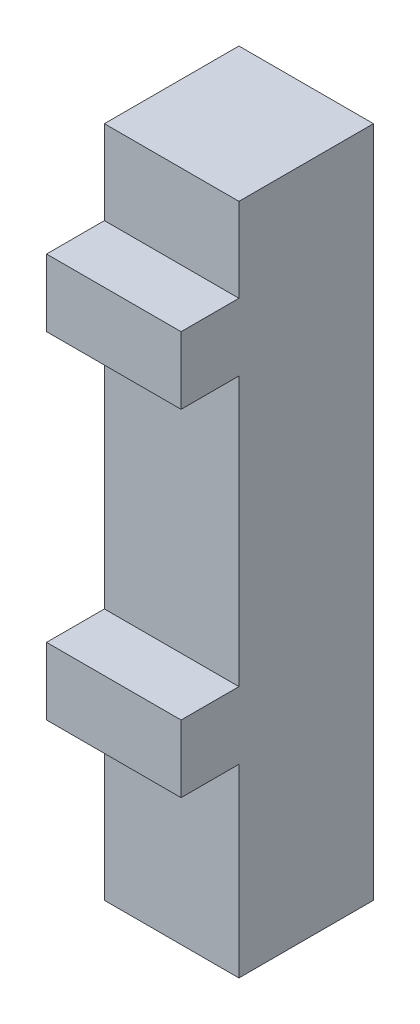
ISO-10303-21;
HEADER;
FILE_DESCRIPTION(('STEP AP214'),'2;1');
FILE_NAME('part.step','',(''),(''),'','','');
FILE_SCHEMA(('AUTOMOTIVE_DESIGN { 1 0 10303 214 1 1 1 1 }'));
ENDSEC;
DATA;
#1=APPLICATION_CONTEXT('core data for automotive mechanical design processes');
#2=APPLICATION_PROTOCOL_DEFINITION('international standard','automotive_design',2000,#1);
#3=PRODUCT_CONTEXT('',#1,'mechanical');
#4=PRODUCT('Part','Part','',(#3));
#5=PRODUCT_RELATED_PRODUCT_CATEGORY('part','',(#4));
#6=PRODUCT_DEFINITION_FORMATION('','',#4);
#7=PRODUCT_DEFINITION_CONTEXT('part definition',#1,'design');
#8=PRODUCT_DEFINITION('design','',#6,#7);
#9=PRODUCT_DEFINITION_SHAPE('','',#8);
#10=(LENGTH_UNIT() NAMED_UNIT(*) SI_UNIT(.MILLI.,.METRE.));
#11=(NAMED_UNIT(*) PLANE_ANGLE_UNIT() SI_UNIT($,.RADIAN.));
#12=(NAMED_UNIT(*) SI_UNIT($,.STERADIAN.) SOLID_ANGLE_UNIT());
#13=UNCERTAINTY_MEASURE_WITH_UNIT(LENGTH_MEASURE(1.E-05),#10,'distance_accuracy_value','');
#14=(GEOMETRIC_REPRESENTATION_CONTEXT(3) GLOBAL_UNCERTAINTY_ASSIGNED_CONTEXT((#13)) GLOBAL_UNIT_ASSIGNED_CONTEXT((#10,
#11,#12)) REPRESENTATION_CONTEXT('',''));
#15=CARTESIAN_POINT('',(0.,0.,0.));
#16=DIRECTION('',(0.,0.,1.));
#17=DIRECTION('',(1.,0.,0.));
#18=AXIS2_PLACEMENT_3D('',#15,#16,#17);
#19=CARTESIAN_POINT('',(-30.6224066390041,500.,79.7095435684647));
#20=DIRECTION('',(0.,0.,-1.));
#21=DIRECTION('',(-1.,0.,0.));
#22=AXIS2_PLACEMENT_3D('',#19,#20,#21);
#23=PLANE('',#22);
#24=DIRECTION('',(1.,0.,0.));
#25=VECTOR('',#24,1.);
#26=CARTESIAN_POINT('',(-30.6224066390041,137.588238815811,79.7095435684647));
#27=LINE('',#26,#25);
#28=CARTESIAN_POINT('',(-30.6224066390041,137.588238815811,79.7095435684647));
#29=VERTEX_POINT('',#28);
#30=CARTESIAN_POINT('',(69.3775933609959,137.588238815811,79.7095435684647));
#31=VERTEX_POINT('',#30);
#32=EDGE_CURVE('E144',#29,#31,#27,.T.);
#33=ORIENTED_EDGE('',*,*,#32,.F.);
#34=DIRECTION('',(0.,-1.,0.));
#35=VECTOR('',#34,1.);
#36=CARTESIAN_POINT('',(-30.6224066390041,500.,79.7095435684647));
#37=LINE('',#36,#35);
#38=CARTESIAN_POINT('',(-30.6224066390041,0.,79.7095435684647));
#39=VERTEX_POINT('',#38);
#40=EDGE_CURVE('E48',#29,#39,#37,.T.);
#41=ORIENTED_EDGE('',*,*,#40,.T.);
#42=DIRECTION('',(1.,0.,0.));
#43=VECTOR('',#42,1.);
#44=CARTESIAN_POINT('',(-30.6224066390041,0.,79.7095435684647));
#45=LINE('',#44,#43);
#46=CARTESIAN_POINT('',(69.3775933609959,0.,79.7095435684647));
#47=VERTEX_POINT('',#46);
#48=EDGE_CURVE('E186',#39,#47,#45,.T.);
#49=ORIENTED_EDGE('',*,*,#48,.T.);
#50=DIRECTION('',(0.,-1.,0.));
#51=VECTOR('',#50,1.);
#52=CARTESIAN_POINT('',(69.3775933609959,500.,79.7095435684647));
#53=LINE('',#52,#51);
#54=EDGE_CURVE('E164',#31,#47,#53,.T.);
#55=ORIENTED_EDGE('',*,*,#54,.F.);
#56=EDGE_LOOP('',(#33,#41,#49,#55));
#57=FACE_BOUND('',#56,.T.);
#58=ADVANCED_FACE('F39',(#57),#23,.F.);
#59=DIRECTION('',(-1.,0.,0.));
#60=VECTOR('',#59,1.);
#61=CARTESIAN_POINT('',(69.3775933609959,187.588238815811,79.7095435684647));
#62=LINE('',#61,#60);
#63=CARTESIAN_POINT('',(69.3775933609959,187.588238815811,79.7095435684647));
#64=VERTEX_POINT('',#63);
#65=CARTESIAN_POINT('',(-30.6224066390041,187.588238815811,79.7095435684647));
#66=VERTEX_POINT('',#65);
#67=EDGE_CURVE('E132',#64,#66,#62,.T.);
#68=ORIENTED_EDGE('',*,*,#67,.F.);
#69=CARTESIAN_POINT('',(69.3775933609959,387.588238815811,79.7095435684647));
#70=VERTEX_POINT('',#69);
#71=EDGE_CURVE('E163',#70,#64,#53,.T.);
#72=ORIENTED_EDGE('',*,*,#71,.F.);
#73=DIRECTION('',(-1.,0.,0.));
#74=VECTOR('',#73,1.);
#75=CARTESIAN_POINT('',(0.,387.588238815811,79.7095435684647));
#76=LINE('',#75,#74);
#77=CARTESIAN_POINT('',(-30.6224066390041,387.588238815811,79.7095435684647));
#78=VERTEX_POINT('',#77);
#79=EDGE_CURVE('E155',#70,#78,#76,.T.);
#80=ORIENTED_EDGE('',*,*,#79,.T.);
#81=EDGE_CURVE('E47',#78,#66,#37,.T.);
#82=ORIENTED_EDGE('',*,*,#81,.T.);
#83=EDGE_LOOP('',(#68,#72,#80,#82));
#84=FACE_BOUND('',#83,.T.);
#85=ADVANCED_FACE('F154',(#84),#23,.F.);
#86=CARTESIAN_POINT('',(-30.6224066390041,500.,79.7095435684647));
#87=VERTEX_POINT('',#86);
#88=CARTESIAN_POINT('',(-30.6224066390041,437.588238815811,79.7095435684647));
#89=VERTEX_POINT('',#88);
#90=EDGE_CURVE('E11',#87,#89,#37,.T.);
#91=ORIENTED_EDGE('',*,*,#90,.T.);
#92=DIRECTION('',(1.,0.,0.));
#93=VECTOR('',#92,1.);
#94=CARTESIAN_POINT('',(0.,437.588238815811,79.7095435684647));
#95=LINE('',#94,#93);
#96=CARTESIAN_POINT('',(69.3775933609959,437.588238815811,79.7095435684647));
#97=VERTEX_POINT('',#96);
#98=EDGE_CURVE('E207',#89,#97,#95,.T.);
#99=ORIENTED_EDGE('',*,*,#98,.T.);
#100=CARTESIAN_POINT('',(69.3775933609959,500.,79.7095435684647));
#101=VERTEX_POINT('',#100);
#102=EDGE_CURVE('E156',#101,#97,#53,.T.);
#103=ORIENTED_EDGE('',*,*,#102,.F.);
#104=DIRECTION('',(1.,0.,0.));
#105=VECTOR('',#104,1.);
#106=CARTESIAN_POINT('',(-30.6224066390041,500.,79.7095435684647));
#107=LINE('',#106,#105);
#108=EDGE_CURVE('E194',#87,#101,#107,.T.);
#109=ORIENTED_EDGE('',*,*,#108,.F.);
#110=EDGE_LOOP('',(#91,#99,#103,#109));
#111=FACE_BOUND('',#110,.T.);
#112=ADVANCED_FACE('F241',(#111),#23,.F.);
#113=CARTESIAN_POINT('',(-30.6224066390042,500.,-20.2904564315353));
#114=DIRECTION('',(1.,0.,0.));
#115=DIRECTION('',(0.,0.,-1.));
#116=AXIS2_PLACEMENT_3D('',#113,#114,#115);
#117=PLANE('',#116);
#118=DIRECTION('',(0.,0.,1.));
#119=VECTOR('',#118,1.);
#120=CARTESIAN_POINT('',(-30.6224066390042,0.,-20.2904564315353));
#121=LINE('',#120,#119);
#122=CARTESIAN_POINT('',(-30.6224066390042,0.,-20.2904564315353));
#123=VERTEX_POINT('',#122);
#124=EDGE_CURVE('E188',#123,#39,#121,.T.);
#125=ORIENTED_EDGE('',*,*,#124,.T.);
#126=ORIENTED_EDGE('',*,*,#40,.F.);
#127=DIRECTION('',(0.,0.,-1.));
#128=VECTOR('',#127,1.);
#129=CARTESIAN_POINT('',(-30.6224066390041,137.588238815811,122.709543568465));
#130=LINE('',#129,#128);
#131=CARTESIAN_POINT('',(-30.6224066390041,137.588238815811,122.709543568465));
#132=VERTEX_POINT('',#131);
#133=EDGE_CURVE('E226',#132,#29,#130,.T.);
#134=ORIENTED_EDGE('',*,*,#133,.F.);
#135=DIRECTION('',(0.,-1.,0.));
#136=VECTOR('',#135,1.);
#137=CARTESIAN_POINT('',(-30.6224066390041,187.588238815811,122.709543568465));
#138=LINE('',#137,#136);
#139=CARTESIAN_POINT('',(-30.6224066390041,187.588238815811,122.709543568465));
#140=VERTEX_POINT('',#139);
#141=EDGE_CURVE('E145',#140,#132,#138,.T.);
#142=ORIENTED_EDGE('',*,*,#141,.F.);
#143=DIRECTION('',(0.,0.,-1.));
#144=VECTOR('',#143,1.);
#145=CARTESIAN_POINT('',(-30.6224066390041,187.588238815811,122.709543568465));
#146=LINE('',#145,#144);
#147=EDGE_CURVE('E136',#140,#66,#146,.T.);
#148=ORIENTED_EDGE('',*,*,#147,.T.);
#149=ORIENTED_EDGE('',*,*,#81,.F.);
#150=DIRECTION('',(0.,0.,-1.));
#151=VECTOR('',#150,1.);
#152=CARTESIAN_POINT('',(-30.6224066390041,387.588238815811,122.709543568465));
#153=LINE('',#152,#151);
#154=CARTESIAN_POINT('',(-30.6224066390041,387.588238815811,122.709543568465));
#155=VERTEX_POINT('',#154);
#156=EDGE_CURVE('E63',#155,#78,#153,.T.);
#157=ORIENTED_EDGE('',*,*,#156,.F.);
#158=DIRECTION('',(0.,-1.,0.));
#159=VECTOR('',#158,1.);
#160=CARTESIAN_POINT('',(-30.6224066390041,0.,122.709543568465));
#161=LINE('',#160,#159);
#162=CARTESIAN_POINT('',(-30.6224066390041,437.588238815811,122.709543568465));
#163=VERTEX_POINT('',#162);
#164=EDGE_CURVE('E213',#163,#155,#161,.T.);
#165=ORIENTED_EDGE('',*,*,#164,.F.);
#166=DIRECTION('',(0.,0.,-1.));
#167=VECTOR('',#166,1.);
#168=CARTESIAN_POINT('',(-30.6224066390041,437.588238815811,122.709543568465));
#169=LINE('',#168,#167);
#170=EDGE_CURVE('E190',#163,#89,#169,.T.);
#171=ORIENTED_EDGE('',*,*,#170,.T.);
#172=ORIENTED_EDGE('',*,*,#90,.F.);
#173=DIRECTION('',(0.,0.,1.));
#174=VECTOR('',#173,1.);
#175=CARTESIAN_POINT('',(-30.6224066390042,500.,-20.2904564315353));
#176=LINE('',#175,#174);
#177=CARTESIAN_POINT('',(-30.6224066390042,500.,-20.2904564315353));
#178=VERTEX_POINT('',#177);
#179=EDGE_CURVE('E183',#178,#87,#176,.T.);
#180=ORIENTED_EDGE('',*,*,#179,.F.);
#181=DIRECTION('',(0.,-1.,0.));
#182=VECTOR('',#181,1.);
#183=CARTESIAN_POINT('',(-30.6224066390042,500.,-20.2904564315353));
#184=LINE('',#183,#182);
#185=EDGE_CURVE('E172',#178,#123,#184,.T.);
#186=ORIENTED_EDGE('',*,*,#185,.T.);
#187=EDGE_LOOP('',(#125,#126,#134,#142,#148,#149,#157,#165,#171,#172,#180,#186));
#188=FACE_BOUND('',#187,.T.);
#189=ADVANCED_FACE('F41',(#188),#117,.F.);
#190=CARTESIAN_POINT('',(69.3775933609959,500.,-20.2904564315353));
#191=DIRECTION('',(-1.,0.,0.));
#192=DIRECTION('',(0.,0.,1.));
#193=AXIS2_PLACEMENT_3D('',#190,#191,#192);
#194=PLANE('',#193);
#195=DIRECTION('',(0.,0.,-1.));
#196=VECTOR('',#195,1.);
#197=CARTESIAN_POINT('',(69.3775933609959,0.,-20.2904564315353));
#198=LINE('',#197,#196);
#199=CARTESIAN_POINT('',(69.3775933609959,0.,-20.2904564315353));
#200=VERTEX_POINT('',#199);
#201=EDGE_CURVE('E184',#47,#200,#198,.T.);
#202=ORIENTED_EDGE('',*,*,#201,.T.);
#203=DIRECTION('',(0.,-1.,0.));
#204=VECTOR('',#203,1.);
#205=CARTESIAN_POINT('',(69.3775933609959,500.,-20.2904564315353));
#206=LINE('',#205,#204);
#207=CARTESIAN_POINT('',(69.3775933609959,500.,-20.2904564315353));
#208=VERTEX_POINT('',#207);
#209=EDGE_CURVE('E169',#208,#200,#206,.T.);
#210=ORIENTED_EDGE('',*,*,#209,.F.);
#211=DIRECTION('',(0.,0.,-1.));
#212=VECTOR('',#211,1.);
#213=CARTESIAN_POINT('',(69.3775933609959,500.,-20.2904564315353));
#214=LINE('',#213,#212);
#215=EDGE_CURVE('E192',#101,#208,#214,.T.);
#216=ORIENTED_EDGE('',*,*,#215,.F.);
#217=ORIENTED_EDGE('',*,*,#102,.T.);
#218=DIRECTION('',(0.,0.,-1.));
#219=VECTOR('',#218,1.);
#220=CARTESIAN_POINT('',(69.3775933609959,437.588238815811,122.709543568465));
#221=LINE('',#220,#219);
#222=CARTESIAN_POINT('',(69.3775933609959,437.588238815811,122.709543568465));
#223=VERTEX_POINT('',#222);
#224=EDGE_CURVE('E202',#223,#97,#221,.T.);
#225=ORIENTED_EDGE('',*,*,#224,.F.);
#226=DIRECTION('',(0.,1.,0.));
#227=VECTOR('',#226,1.);
#228=CARTESIAN_POINT('',(69.3775933609959,0.,122.709543568465));
#229=LINE('',#228,#227);
#230=CARTESIAN_POINT('',(69.3775933609959,387.588238815811,122.709543568465));
#231=VERTEX_POINT('',#230);
#232=EDGE_CURVE('E204',#231,#223,#229,.T.);
#233=ORIENTED_EDGE('',*,*,#232,.F.);
#234=DIRECTION('',(0.,0.,-1.));
#235=VECTOR('',#234,1.);
#236=CARTESIAN_POINT('',(69.3775933609959,387.588238815811,122.709543568465));
#237=LINE('',#236,#235);
#238=EDGE_CURVE('E200',#231,#70,#237,.T.);
#239=ORIENTED_EDGE('',*,*,#238,.T.);
#240=ORIENTED_EDGE('',*,*,#71,.T.);
#241=DIRECTION('',(0.,0.,-1.));
#242=VECTOR('',#241,1.);
#243=CARTESIAN_POINT('',(69.3775933609959,187.588238815811,122.709543568465));
#244=LINE('',#243,#242);
#245=CARTESIAN_POINT('',(69.3775933609959,187.588238815811,122.709543568465));
#246=VERTEX_POINT('',#245);
#247=EDGE_CURVE('E139',#246,#64,#244,.T.);
#248=ORIENTED_EDGE('',*,*,#247,.F.);
#249=DIRECTION('',(0.,1.,0.));
#250=VECTOR('',#249,1.);
#251=CARTESIAN_POINT('',(69.3775933609959,137.588238815811,122.709543568465));
#252=LINE('',#251,#250);
#253=CARTESIAN_POINT('',(69.3775933609959,137.588238815811,122.709543568465));
#254=VERTEX_POINT('',#253);
#255=EDGE_CURVE('E220',#254,#246,#252,.T.);
#256=ORIENTED_EDGE('',*,*,#255,.F.);
#257=DIRECTION('',(0.,0.,-1.));
#258=VECTOR('',#257,1.);
#259=CARTESIAN_POINT('',(69.3775933609959,137.588238815811,122.709543568465));
#260=LINE('',#259,#258);
#261=EDGE_CURVE('E55',#254,#31,#260,.T.);
#262=ORIENTED_EDGE('',*,*,#261,.T.);
#263=ORIENTED_EDGE('',*,*,#54,.T.);
#264=EDGE_LOOP('',(#202,#210,#216,#217,#225,#233,#239,#240,#248,#256,#262,#263));
#265=FACE_BOUND('',#264,.T.);
#266=ADVANCED_FACE('F235',(#265),#194,.F.);
#267=CARTESIAN_POINT('',(-30.6224066390042,500.,-20.2904564315353));
#268=DIRECTION('',(0.,0.,1.));
#269=DIRECTION('',(1.,0.,0.));
#270=AXIS2_PLACEMENT_3D('',#267,#268,#269);
#271=PLANE('',#270);
#272=DIRECTION('',(-1.,0.,0.));
#273=VECTOR('',#272,1.);
#274=CARTESIAN_POINT('',(-30.6224066390042,0.,-20.2904564315353));
#275=LINE('',#274,#273);
#276=EDGE_CURVE('E181',#200,#123,#275,.T.);
#277=ORIENTED_EDGE('',*,*,#276,.T.);
#278=ORIENTED_EDGE('',*,*,#185,.F.);
#279=DIRECTION('',(-1.,0.,0.));
#280=VECTOR('',#279,1.);
#281=CARTESIAN_POINT('',(-30.6224066390042,500.,-20.2904564315353));
#282=LINE('',#281,#280);
#283=EDGE_CURVE('E178',#208,#178,#282,.T.);
#284=ORIENTED_EDGE('',*,*,#283,.F.);
#285=ORIENTED_EDGE('',*,*,#209,.T.);
#286=EDGE_LOOP('',(#277,#278,#284,#285));
#287=FACE_BOUND('',#286,.T.);
#288=ADVANCED_FACE('F236',(#287),#271,.F.);
#289=CARTESIAN_POINT('',(0.,500.,0.));
#290=DIRECTION('',(0.,1.,0.));
#291=DIRECTION('',(0.,0.,1.));
#292=AXIS2_PLACEMENT_3D('',#289,#290,#291);
#293=PLANE('',#292);
#294=ORIENTED_EDGE('',*,*,#179,.T.);
#295=ORIENTED_EDGE('',*,*,#108,.T.);
#296=ORIENTED_EDGE('',*,*,#215,.T.);
#297=ORIENTED_EDGE('',*,*,#283,.T.);
#298=EDGE_LOOP('',(#294,#295,#296,#297));
#299=FACE_BOUND('',#298,.T.);
#300=ADVANCED_FACE('F238',(#299),#293,.T.);
#301=CARTESIAN_POINT('',(0.,0.,0.));
#302=DIRECTION('',(0.,1.,0.));
#303=DIRECTION('',(0.,0.,1.));
#304=AXIS2_PLACEMENT_3D('',#301,#302,#303);
#305=PLANE('',#304);
#306=ORIENTED_EDGE('',*,*,#124,.F.);
#307=ORIENTED_EDGE('',*,*,#276,.F.);
#308=ORIENTED_EDGE('',*,*,#201,.F.);
#309=ORIENTED_EDGE('',*,*,#48,.F.);
#310=EDGE_LOOP('',(#306,#307,#308,#309));
#311=FACE_BOUND('',#310,.T.);
#312=ADVANCED_FACE('F233',(#311),#305,.F.);
#313=CARTESIAN_POINT('',(0.,437.588238815811,122.709543568465));
#314=DIRECTION('',(0.,1.,0.));
#315=DIRECTION('',(0.,0.,1.));
#316=AXIS2_PLACEMENT_3D('',#313,#314,#315);
#317=PLANE('',#316);
#318=ORIENTED_EDGE('',*,*,#98,.F.);
#319=ORIENTED_EDGE('',*,*,#170,.F.);
#320=DIRECTION('',(1.,0.,0.));
#321=VECTOR('',#320,1.);
#322=CARTESIAN_POINT('',(0.,437.588238815811,122.709543568465));
#323=LINE('',#322,#321);
#324=EDGE_CURVE('E206',#163,#223,#323,.T.);
#325=ORIENTED_EDGE('',*,*,#324,.T.);
#326=ORIENTED_EDGE('',*,*,#224,.T.);
#327=EDGE_LOOP('',(#318,#319,#325,#326));
#328=FACE_BOUND('',#327,.T.);
#329=ADVANCED_FACE('F244',(#328),#317,.T.);
#330=CARTESIAN_POINT('',(0.,387.588238815811,122.709543568465));
#331=DIRECTION('',(0.,-1.,0.));
#332=DIRECTION('',(0.,0.,-1.));
#333=AXIS2_PLACEMENT_3D('',#330,#331,#332);
#334=PLANE('',#333);
#335=ORIENTED_EDGE('',*,*,#79,.F.);
#336=ORIENTED_EDGE('',*,*,#238,.F.);
#337=DIRECTION('',(-1.,0.,0.));
#338=VECTOR('',#337,1.);
#339=CARTESIAN_POINT('',(0.,387.588238815811,122.709543568465));
#340=LINE('',#339,#338);
#341=EDGE_CURVE('E211',#231,#155,#340,.T.);
#342=ORIENTED_EDGE('',*,*,#341,.T.);
#343=ORIENTED_EDGE('',*,*,#156,.T.);
#344=EDGE_LOOP('',(#335,#336,#342,#343));
#345=FACE_BOUND('',#344,.T.);
#346=ADVANCED_FACE('F251',(#345),#334,.T.);
#347=CARTESIAN_POINT('',(0.,0.,122.709543568465));
#348=DIRECTION('',(0.,0.,1.));
#349=DIRECTION('',(1.,0.,0.));
#350=AXIS2_PLACEMENT_3D('',#347,#348,#349);
#351=PLANE('',#350);
#352=ORIENTED_EDGE('',*,*,#324,.F.);
#353=ORIENTED_EDGE('',*,*,#164,.T.);
#354=ORIENTED_EDGE('',*,*,#341,.F.);
#355=ORIENTED_EDGE('',*,*,#232,.T.);
#356=EDGE_LOOP('',(#352,#353,#354,#355));
#357=FACE_BOUND('',#356,.T.);
#358=ADVANCED_FACE('F250',(#357),#351,.T.);
#359=CARTESIAN_POINT('',(-30.6224066390041,137.588238815811,122.709543568465));
#360=DIRECTION('',(0.,1.,0.));
#361=DIRECTION('',(0.,0.,1.));
#362=AXIS2_PLACEMENT_3D('',#359,#360,#361);
#363=PLANE('',#362);
#364=ORIENTED_EDGE('',*,*,#32,.T.);
#365=ORIENTED_EDGE('',*,*,#261,.F.);
#366=DIRECTION('',(1.,0.,0.));
#367=VECTOR('',#366,1.);
#368=CARTESIAN_POINT('',(-30.6224066390041,137.588238815811,122.709543568465));
#369=LINE('',#368,#367);
#370=EDGE_CURVE('E218',#132,#254,#369,.T.);
#371=ORIENTED_EDGE('',*,*,#370,.F.);
#372=ORIENTED_EDGE('',*,*,#133,.T.);
#373=EDGE_LOOP('',(#364,#365,#371,#372));
#374=FACE_BOUND('',#373,.T.);
#375=ADVANCED_FACE('F228',(#374),#363,.F.);
#376=CARTESIAN_POINT('',(69.3775933609959,187.588238815811,122.709543568465));
#377=DIRECTION('',(0.,-1.,0.));
#378=DIRECTION('',(0.,0.,-1.));
#379=AXIS2_PLACEMENT_3D('',#376,#377,#378);
#380=PLANE('',#379);
#381=ORIENTED_EDGE('',*,*,#67,.T.);
#382=ORIENTED_EDGE('',*,*,#147,.F.);
#383=DIRECTION('',(-1.,0.,0.));
#384=VECTOR('',#383,1.);
#385=CARTESIAN_POINT('',(69.3775933609959,187.588238815811,122.709543568465));
#386=LINE('',#385,#384);
#387=EDGE_CURVE('E152',#246,#140,#386,.T.);
#388=ORIENTED_EDGE('',*,*,#387,.F.);
#389=ORIENTED_EDGE('',*,*,#247,.T.);
#390=EDGE_LOOP('',(#381,#382,#388,#389));
#391=FACE_BOUND('',#390,.T.);
#392=ADVANCED_FACE('F134',(#391),#380,.F.);
#393=CARTESIAN_POINT('',(0.,0.,122.709543568465));
#394=DIRECTION('',(0.,0.,1.));
#395=DIRECTION('',(1.,0.,0.));
#396=AXIS2_PLACEMENT_3D('',#393,#394,#395);
#397=PLANE('',#396);
#398=ORIENTED_EDGE('',*,*,#141,.T.);
#399=ORIENTED_EDGE('',*,*,#370,.T.);
#400=ORIENTED_EDGE('',*,*,#255,.T.);
#401=ORIENTED_EDGE('',*,*,#387,.T.);
#402=EDGE_LOOP('',(#398,#399,#400,#401));
#403=FACE_BOUND('',#402,.T.);
#404=ADVANCED_FACE('F253',(#403),#397,.T.);
#405=CLOSED_SHELL('',(#58,#85,#112,#189,#266,#288,#300,#312,#329,#346,#358,#375,#392,#404));
#406=MANIFOLD_SOLID_BREP('B2',#405);
#407=ADVANCED_BREP_SHAPE_REPRESENTATION('',(#18,#406),#14);
#408=SHAPE_DEFINITION_REPRESENTATION(#9,#407);
ENDSEC;
END-ISO-10303-21;
